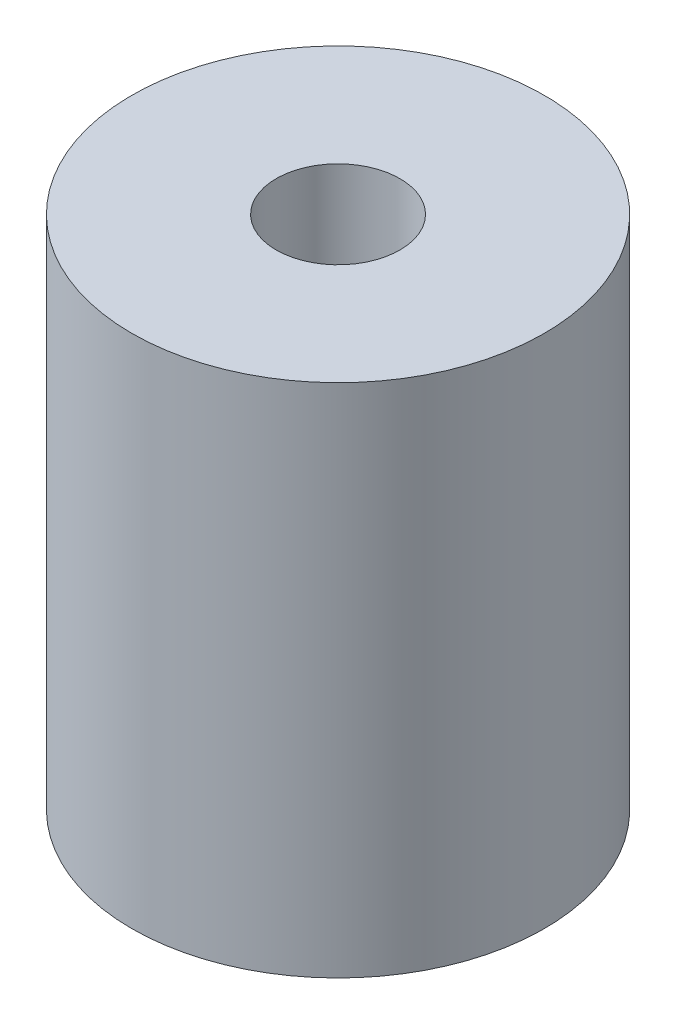
ISO-10303-21;
HEADER;
FILE_DESCRIPTION(('STEP AP214'),'2;1');
FILE_NAME('part.step','',(''),(''),'','','');
FILE_SCHEMA(('AUTOMOTIVE_DESIGN { 1 0 10303 214 1 1 1 1 }'));
ENDSEC;
DATA;
#1=APPLICATION_CONTEXT('core data for automotive mechanical design processes');
#2=APPLICATION_PROTOCOL_DEFINITION('international standard','automotive_design',2000,#1);
#3=PRODUCT_CONTEXT('',#1,'mechanical');
#4=PRODUCT('Part','Part','',(#3));
#5=PRODUCT_RELATED_PRODUCT_CATEGORY('part','',(#4));
#6=PRODUCT_DEFINITION_FORMATION('','',#4);
#7=PRODUCT_DEFINITION_CONTEXT('part definition',#1,'design');
#8=PRODUCT_DEFINITION('design','',#6,#7);
#9=PRODUCT_DEFINITION_SHAPE('','',#8);
#10=(LENGTH_UNIT() NAMED_UNIT(*) SI_UNIT(.MILLI.,.METRE.));
#11=(NAMED_UNIT(*) PLANE_ANGLE_UNIT() SI_UNIT($,.RADIAN.));
#12=(NAMED_UNIT(*) SI_UNIT($,.STERADIAN.) SOLID_ANGLE_UNIT());
#13=UNCERTAINTY_MEASURE_WITH_UNIT(LENGTH_MEASURE(1.E-05),#10,'distance_accuracy_value','');
#14=(GEOMETRIC_REPRESENTATION_CONTEXT(3) GLOBAL_UNCERTAINTY_ASSIGNED_CONTEXT((#13)) GLOBAL_UNIT_ASSIGNED_CONTEXT((#10,
#11,#12)) REPRESENTATION_CONTEXT('',''));
#15=CARTESIAN_POINT('',(0.,0.,0.));
#16=DIRECTION('',(0.,0.,1.));
#17=DIRECTION('',(1.,0.,0.));
#18=AXIS2_PLACEMENT_3D('',#15,#16,#17);
#19=CARTESIAN_POINT('',(0.,0.,0.));
#20=DIRECTION('',(0.,1.,0.));
#21=DIRECTION('',(0.,0.,1.));
#22=AXIS2_PLACEMENT_3D('',#19,#20,#21);
#23=CYLINDRICAL_SURFACE('',#22,3.);
#24=CARTESIAN_POINT('',(0.,25.,0.));
#25=DIRECTION('',(0.,1.,0.));
#26=DIRECTION('',(0.,0.,1.));
#27=AXIS2_PLACEMENT_3D('',#24,#25,#26);
#28=CIRCLE('',#27,3.);
#29=CARTESIAN_POINT('',(0.,25.,3.));
#30=VERTEX_POINT('',#29);
#31=EDGE_CURVE('E42',#30,#30,#28,.T.);
#32=ORIENTED_EDGE('',*,*,#31,.T.);
#33=EDGE_LOOP('',(#32));
#34=FACE_BOUND('',#33,.T.);
#35=CARTESIAN_POINT('',(0.,10.,0.));
#36=DIRECTION('',(0.,-1.,0.));
#37=DIRECTION('',(0.,0.,-1.));
#38=AXIS2_PLACEMENT_3D('',#35,#36,#37);
#39=CIRCLE('',#38,3.);
#40=CARTESIAN_POINT('',(0.,10.,-3.));
#41=VERTEX_POINT('',#40);
#42=EDGE_CURVE('E33',#41,#41,#39,.F.);
#43=ORIENTED_EDGE('',*,*,#42,.F.);
#44=EDGE_LOOP('',(#43));
#45=FACE_BOUND('',#44,.T.);
#46=ADVANCED_FACE('F29',(#34,#45),#23,.F.);
#47=CARTESIAN_POINT('',(0.,25.,0.));
#48=DIRECTION('',(0.,-1.,0.));
#49=DIRECTION('',(0.,0.,-1.));
#50=AXIS2_PLACEMENT_3D('',#47,#48,#49);
#51=CYLINDRICAL_SURFACE('',#50,10.);
#52=CARTESIAN_POINT('',(0.,25.,0.));
#53=DIRECTION('',(0.,1.,0.));
#54=DIRECTION('',(0.,0.,1.));
#55=AXIS2_PLACEMENT_3D('',#52,#53,#54);
#56=CIRCLE('',#55,10.);
#57=CARTESIAN_POINT('',(0.,25.,10.));
#58=VERTEX_POINT('',#57);
#59=EDGE_CURVE('E10',#58,#58,#56,.T.);
#60=ORIENTED_EDGE('',*,*,#59,.F.);
#61=EDGE_LOOP('',(#60));
#62=FACE_BOUND('',#61,.T.);
#63=CARTESIAN_POINT('',(0.,0.,0.));
#64=DIRECTION('',(0.,1.,0.));
#65=DIRECTION('',(0.,0.,1.));
#66=AXIS2_PLACEMENT_3D('',#63,#64,#65);
#67=CIRCLE('',#66,10.);
#68=CARTESIAN_POINT('',(0.,0.,10.));
#69=VERTEX_POINT('',#68);
#70=EDGE_CURVE('E37',#69,#69,#67,.T.);
#71=ORIENTED_EDGE('',*,*,#70,.T.);
#72=EDGE_LOOP('',(#71));
#73=FACE_BOUND('',#72,.T.);
#74=ADVANCED_FACE('F31',(#62,#73),#51,.T.);
#75=CARTESIAN_POINT('',(0.,25.,0.));
#76=DIRECTION('',(0.,1.,0.));
#77=DIRECTION('',(0.,0.,1.));
#78=AXIS2_PLACEMENT_3D('',#75,#76,#77);
#79=PLANE('',#78);
#80=ORIENTED_EDGE('',*,*,#31,.F.);
#81=EDGE_LOOP('',(#80));
#82=FACE_BOUND('',#81,.T.);
#83=ORIENTED_EDGE('',*,*,#59,.T.);
#84=EDGE_LOOP('',(#83));
#85=FACE_BOUND('',#84,.T.);
#86=ADVANCED_FACE('F64',(#82,#85),#79,.T.);
#87=CARTESIAN_POINT('',(0.,0.,0.));
#88=DIRECTION('',(0.,1.,0.));
#89=DIRECTION('',(0.,0.,1.));
#90=AXIS2_PLACEMENT_3D('',#87,#88,#89);
#91=PLANE('',#90);
#92=CARTESIAN_POINT('',(0.,0.,0.));
#93=DIRECTION('',(0.,-1.,0.));
#94=DIRECTION('',(0.,0.,-1.));
#95=AXIS2_PLACEMENT_3D('',#92,#93,#94);
#96=CIRCLE('',#95,4.5);
#97=CARTESIAN_POINT('',(0.,0.,-4.5));
#98=VERTEX_POINT('',#97);
#99=EDGE_CURVE('E46',#98,#98,#96,.T.);
#100=ORIENTED_EDGE('',*,*,#99,.F.);
#101=EDGE_LOOP('',(#100));
#102=FACE_BOUND('',#101,.T.);
#103=ORIENTED_EDGE('',*,*,#70,.F.);
#104=EDGE_LOOP('',(#103));
#105=FACE_BOUND('',#104,.T.);
#106=ADVANCED_FACE('F71',(#102,#105),#91,.F.);
#107=CARTESIAN_POINT('',(0.,10.,0.));
#108=DIRECTION('',(0.,-1.,0.));
#109=DIRECTION('',(0.,0.,-1.));
#110=AXIS2_PLACEMENT_3D('',#107,#108,#109);
#111=PLANE('',#110);
#112=CARTESIAN_POINT('',(0.,10.,0.));
#113=DIRECTION('',(0.,-1.,0.));
#114=DIRECTION('',(0.,0.,-1.));
#115=AXIS2_PLACEMENT_3D('',#112,#113,#114);
#116=CIRCLE('',#115,4.5);
#117=CARTESIAN_POINT('',(0.,10.,-4.5));
#118=VERTEX_POINT('',#117);
#119=EDGE_CURVE('E49',#118,#118,#116,.T.);
#120=ORIENTED_EDGE('',*,*,#119,.T.);
#121=EDGE_LOOP('',(#120));
#122=FACE_BOUND('',#121,.T.);
#123=ORIENTED_EDGE('',*,*,#42,.T.);
#124=EDGE_LOOP('',(#123));
#125=FACE_BOUND('',#124,.T.);
#126=ADVANCED_FACE('F56',(#122,#125),#111,.T.);
#127=CARTESIAN_POINT('',(0.,10.,0.));
#128=DIRECTION('',(0.,-1.,0.));
#129=DIRECTION('',(0.,0.,-1.));
#130=AXIS2_PLACEMENT_3D('',#127,#128,#129);
#131=CYLINDRICAL_SURFACE('',#130,4.5);
#132=ORIENTED_EDGE('',*,*,#119,.F.);
#133=EDGE_LOOP('',(#132));
#134=FACE_BOUND('',#133,.T.);
#135=ORIENTED_EDGE('',*,*,#99,.T.);
#136=EDGE_LOOP('',(#135));
#137=FACE_BOUND('',#136,.T.);
#138=ADVANCED_FACE('F68',(#134,#137),#131,.F.);
#139=CLOSED_SHELL('',(#46,#74,#86,#106,#126,#138));
#140=MANIFOLD_SOLID_BREP('B2',#139);
#141=ADVANCED_BREP_SHAPE_REPRESENTATION('',(#18,#140),#14);
#142=SHAPE_DEFINITION_REPRESENTATION(#9,#141);
ENDSEC;
END-ISO-10303-21;
